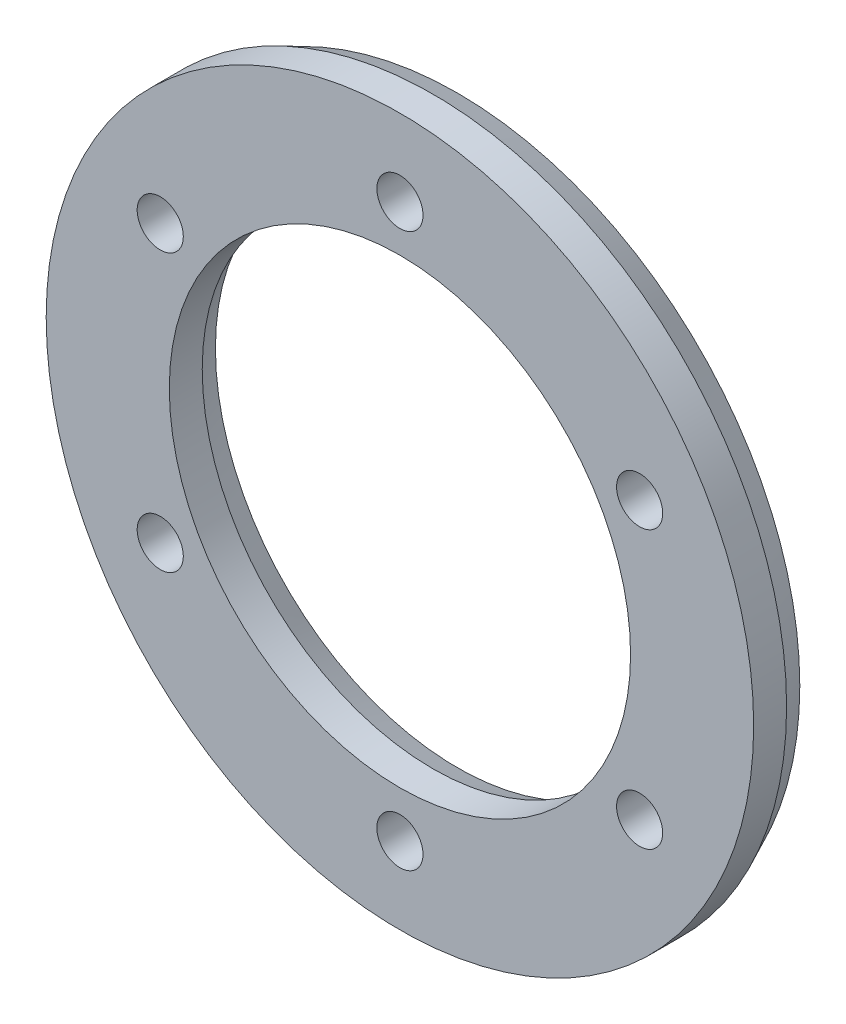
ISO-10303-21;
HEADER;
FILE_DESCRIPTION(('STEP AP214'),'2;1');
FILE_NAME('part.step','',(''),(''),'','','');
FILE_SCHEMA(('AUTOMOTIVE_DESIGN { 1 0 10303 214 1 1 1 1 }'));
ENDSEC;
DATA;
#1=APPLICATION_CONTEXT('core data for automotive mechanical design processes');
#2=APPLICATION_PROTOCOL_DEFINITION('international standard','automotive_design',2000,#1);
#3=PRODUCT_CONTEXT('',#1,'mechanical');
#4=PRODUCT('Part','Part','',(#3));
#5=PRODUCT_RELATED_PRODUCT_CATEGORY('part','',(#4));
#6=PRODUCT_DEFINITION_FORMATION('','',#4);
#7=PRODUCT_DEFINITION_CONTEXT('part definition',#1,'design');
#8=PRODUCT_DEFINITION('design','',#6,#7);
#9=PRODUCT_DEFINITION_SHAPE('','',#8);
#10=(LENGTH_UNIT() NAMED_UNIT(*) SI_UNIT(.MILLI.,.METRE.));
#11=(NAMED_UNIT(*) PLANE_ANGLE_UNIT() SI_UNIT($,.RADIAN.));
#12=(NAMED_UNIT(*) SI_UNIT($,.STERADIAN.) SOLID_ANGLE_UNIT());
#13=UNCERTAINTY_MEASURE_WITH_UNIT(LENGTH_MEASURE(1.E-05),#10,'distance_accuracy_value','');
#14=(GEOMETRIC_REPRESENTATION_CONTEXT(3) GLOBAL_UNCERTAINTY_ASSIGNED_CONTEXT((#13)) GLOBAL_UNIT_ASSIGNED_CONTEXT((#10,
#11,#12)) REPRESENTATION_CONTEXT('',''));
#15=CARTESIAN_POINT('',(0.,0.,0.));
#16=DIRECTION('',(0.,0.,1.));
#17=DIRECTION('',(1.,0.,0.));
#18=AXIS2_PLACEMENT_3D('',#15,#16,#17);
#19=CARTESIAN_POINT('',(0.,0.,5.));
#20=DIRECTION('',(0.,0.,1.));
#21=DIRECTION('',(1.,0.,0.));
#22=AXIS2_PLACEMENT_3D('',#19,#20,#21);
#23=PLANE('',#22);
#24=CARTESIAN_POINT('',(-20.7846096908266,-11.9999999999998,5.));
#25=DIRECTION('',(0.,0.,1.));
#26=DIRECTION('',(1.,0.,0.));
#27=AXIS2_PLACEMENT_3D('',#24,#25,#26);
#28=CIRCLE('',#27,2.00000000000001);
#29=CARTESIAN_POINT('',(-18.7846096908266,-11.9999999999998,5.));
#30=VERTEX_POINT('',#29);
#31=EDGE_CURVE('E107',#30,#30,#28,.T.);
#32=ORIENTED_EDGE('',*,*,#31,.F.);
#33=EDGE_LOOP('',(#32));
#34=FACE_BOUND('',#33,.T.);
#35=CARTESIAN_POINT('',(20.7846096908265,-12.0000000000001,5.));
#36=DIRECTION('',(0.,0.,1.));
#37=DIRECTION('',(1.,0.,0.));
#38=AXIS2_PLACEMENT_3D('',#35,#36,#37);
#39=CIRCLE('',#38,2.);
#40=CARTESIAN_POINT('',(22.7846096908265,-12.0000000000001,5.));
#41=VERTEX_POINT('',#40);
#42=EDGE_CURVE('E91',#41,#41,#39,.T.);
#43=ORIENTED_EDGE('',*,*,#42,.F.);
#44=EDGE_LOOP('',(#43));
#45=FACE_BOUND('',#44,.T.);
#46=CARTESIAN_POINT('',(20.7846096908266,12.,5.));
#47=DIRECTION('',(0.,0.,1.));
#48=DIRECTION('',(1.,0.,0.));
#49=AXIS2_PLACEMENT_3D('',#46,#47,#48);
#50=CIRCLE('',#49,2.00000000000001);
#51=CARTESIAN_POINT('',(22.7846096908266,12.,5.));
#52=VERTEX_POINT('',#51);
#53=EDGE_CURVE('E78',#52,#52,#50,.T.);
#54=ORIENTED_EDGE('',*,*,#53,.F.);
#55=EDGE_LOOP('',(#54));
#56=FACE_BOUND('',#55,.T.);
#57=CARTESIAN_POINT('',(0.,0.,5.));
#58=DIRECTION('',(0.,0.,1.));
#59=DIRECTION('',(1.,0.,0.));
#60=AXIS2_PLACEMENT_3D('',#57,#58,#59);
#61=CIRCLE('',#60,30.675);
#62=CARTESIAN_POINT('',(30.675,0.,5.));
#63=VERTEX_POINT('',#62);
#64=EDGE_CURVE('E70',#63,#63,#61,.T.);
#65=ORIENTED_EDGE('',*,*,#64,.T.);
#66=EDGE_LOOP('',(#65));
#67=FACE_BOUND('',#66,.T.);
#68=CARTESIAN_POINT('',(0.,0.,5.));
#69=DIRECTION('',(0.,0.,1.));
#70=DIRECTION('',(1.,0.,0.));
#71=AXIS2_PLACEMENT_3D('',#68,#69,#70);
#72=CIRCLE('',#71,20.);
#73=CARTESIAN_POINT('',(20.,0.,5.));
#74=VERTEX_POINT('',#73);
#75=EDGE_CURVE('E74',#74,#74,#72,.T.);
#76=ORIENTED_EDGE('',*,*,#75,.F.);
#77=EDGE_LOOP('',(#76));
#78=FACE_BOUND('',#77,.T.);
#79=CARTESIAN_POINT('',(0.,24.,5.));
#80=DIRECTION('',(0.,0.,1.));
#81=DIRECTION('',(1.,0.,0.));
#82=AXIS2_PLACEMENT_3D('',#79,#80,#81);
#83=CIRCLE('',#82,2.);
#84=CARTESIAN_POINT('',(2.00000000000001,24.,5.));
#85=VERTEX_POINT('',#84);
#86=EDGE_CURVE('E83',#85,#85,#83,.T.);
#87=ORIENTED_EDGE('',*,*,#86,.F.);
#88=EDGE_LOOP('',(#87));
#89=FACE_BOUND('',#88,.T.);
#90=CARTESIAN_POINT('',(-1.70530256582424E-13,-24.,5.));
#91=DIRECTION('',(0.,0.,1.));
#92=DIRECTION('',(1.,0.,0.));
#93=AXIS2_PLACEMENT_3D('',#90,#91,#92);
#94=CIRCLE('',#93,2.);
#95=CARTESIAN_POINT('',(1.99999999999983,-24.,5.));
#96=VERTEX_POINT('',#95);
#97=EDGE_CURVE('E99',#96,#96,#94,.T.);
#98=ORIENTED_EDGE('',*,*,#97,.F.);
#99=EDGE_LOOP('',(#98));
#100=FACE_BOUND('',#99,.T.);
#101=CARTESIAN_POINT('',(-20.7846096908264,12.0000000000002,5.));
#102=DIRECTION('',(0.,0.,1.));
#103=DIRECTION('',(1.,0.,0.));
#104=AXIS2_PLACEMENT_3D('',#101,#102,#103);
#105=CIRCLE('',#104,2.);
#106=CARTESIAN_POINT('',(-18.7846096908264,12.0000000000002,5.));
#107=VERTEX_POINT('',#106);
#108=EDGE_CURVE('E115',#107,#107,#105,.T.);
#109=ORIENTED_EDGE('',*,*,#108,.F.);
#110=EDGE_LOOP('',(#109));
#111=FACE_BOUND('',#110,.T.);
#112=ADVANCED_FACE('F45',(#34,#45,#56,#67,#78,#89,#100,#111),#23,.T.);
#113=CARTESIAN_POINT('',(0.,0.,0.));
#114=DIRECTION('',(0.,0.,1.));
#115=DIRECTION('',(1.,0.,0.));
#116=AXIS2_PLACEMENT_3D('',#113,#114,#115);
#117=PLANE('',#116);
#118=CARTESIAN_POINT('',(0.,0.,0.));
#119=DIRECTION('',(0.,0.,1.));
#120=DIRECTION('',(1.,0.,0.));
#121=AXIS2_PLACEMENT_3D('',#118,#119,#120);
#122=CIRCLE('',#121,29.675);
#123=CARTESIAN_POINT('',(29.675,0.,0.));
#124=VERTEX_POINT('',#123);
#125=EDGE_CURVE('E54',#124,#124,#122,.F.);
#126=ORIENTED_EDGE('',*,*,#125,.T.);
#127=EDGE_LOOP('',(#126));
#128=FACE_BOUND('',#127,.T.);
#129=CARTESIAN_POINT('',(0.,0.,0.));
#130=DIRECTION('',(0.,0.,1.));
#131=DIRECTION('',(1.,0.,0.));
#132=AXIS2_PLACEMENT_3D('',#129,#130,#131);
#133=CIRCLE('',#132,21.);
#134=CARTESIAN_POINT('',(21.,0.,0.));
#135=VERTEX_POINT('',#134);
#136=EDGE_CURVE('E59',#135,#135,#133,.T.);
#137=ORIENTED_EDGE('',*,*,#136,.T.);
#138=EDGE_LOOP('',(#137));
#139=FACE_BOUND('',#138,.T.);
#140=CARTESIAN_POINT('',(20.7846096908266,12.,0.));
#141=DIRECTION('',(0.,0.,1.));
#142=DIRECTION('',(1.,0.,0.));
#143=AXIS2_PLACEMENT_3D('',#140,#141,#142);
#144=CIRCLE('',#143,2.00000000000001);
#145=CARTESIAN_POINT('',(22.7846096908266,12.,0.));
#146=VERTEX_POINT('',#145);
#147=EDGE_CURVE('E79',#146,#146,#144,.T.);
#148=ORIENTED_EDGE('',*,*,#147,.T.);
#149=EDGE_LOOP('',(#148));
#150=FACE_BOUND('',#149,.T.);
#151=CARTESIAN_POINT('',(0.,24.,0.));
#152=DIRECTION('',(0.,0.,1.));
#153=DIRECTION('',(1.,0.,0.));
#154=AXIS2_PLACEMENT_3D('',#151,#152,#153);
#155=CIRCLE('',#154,2.);
#156=CARTESIAN_POINT('',(2.00000000000001,24.,0.));
#157=VERTEX_POINT('',#156);
#158=EDGE_CURVE('E87',#157,#157,#155,.T.);
#159=ORIENTED_EDGE('',*,*,#158,.T.);
#160=EDGE_LOOP('',(#159));
#161=FACE_BOUND('',#160,.T.);
#162=CARTESIAN_POINT('',(20.7846096908265,-12.0000000000001,0.));
#163=DIRECTION('',(0.,0.,1.));
#164=DIRECTION('',(1.,0.,0.));
#165=AXIS2_PLACEMENT_3D('',#162,#163,#164);
#166=CIRCLE('',#165,2.);
#167=CARTESIAN_POINT('',(22.7846096908265,-12.0000000000001,0.));
#168=VERTEX_POINT('',#167);
#169=EDGE_CURVE('E95',#168,#168,#166,.T.);
#170=ORIENTED_EDGE('',*,*,#169,.T.);
#171=EDGE_LOOP('',(#170));
#172=FACE_BOUND('',#171,.T.);
#173=CARTESIAN_POINT('',(-1.70530256582424E-13,-24.,0.));
#174=DIRECTION('',(0.,0.,1.));
#175=DIRECTION('',(1.,0.,0.));
#176=AXIS2_PLACEMENT_3D('',#173,#174,#175);
#177=CIRCLE('',#176,2.);
#178=CARTESIAN_POINT('',(1.99999999999983,-24.,0.));
#179=VERTEX_POINT('',#178);
#180=EDGE_CURVE('E103',#179,#179,#177,.T.);
#181=ORIENTED_EDGE('',*,*,#180,.T.);
#182=EDGE_LOOP('',(#181));
#183=FACE_BOUND('',#182,.T.);
#184=CARTESIAN_POINT('',(-20.7846096908266,-11.9999999999998,0.));
#185=DIRECTION('',(0.,0.,1.));
#186=DIRECTION('',(1.,0.,0.));
#187=AXIS2_PLACEMENT_3D('',#184,#185,#186);
#188=CIRCLE('',#187,2.00000000000001);
#189=CARTESIAN_POINT('',(-18.7846096908266,-11.9999999999998,0.));
#190=VERTEX_POINT('',#189);
#191=EDGE_CURVE('E111',#190,#190,#188,.T.);
#192=ORIENTED_EDGE('',*,*,#191,.T.);
#193=EDGE_LOOP('',(#192));
#194=FACE_BOUND('',#193,.T.);
#195=CARTESIAN_POINT('',(-20.7846096908264,12.0000000000002,0.));
#196=DIRECTION('',(0.,0.,1.));
#197=DIRECTION('',(1.,0.,0.));
#198=AXIS2_PLACEMENT_3D('',#195,#196,#197);
#199=CIRCLE('',#198,2.);
#200=CARTESIAN_POINT('',(-18.7846096908264,12.0000000000002,0.));
#201=VERTEX_POINT('',#200);
#202=EDGE_CURVE('E119',#201,#201,#199,.T.);
#203=ORIENTED_EDGE('',*,*,#202,.T.);
#204=EDGE_LOOP('',(#203));
#205=FACE_BOUND('',#204,.T.);
#206=ADVANCED_FACE('F131',(#128,#139,#150,#161,#172,#183,#194,#205),#117,.F.);
#207=CARTESIAN_POINT('',(0.,0.,5.));
#208=DIRECTION('',(0.,0.,-1.));
#209=DIRECTION('',(-1.,0.,0.));
#210=AXIS2_PLACEMENT_3D('',#207,#208,#209);
#211=CYLINDRICAL_SURFACE('',#210,30.675);
#212=CARTESIAN_POINT('',(0.,0.,2.14450692050951));
#213=DIRECTION('',(0.,0.,1.));
#214=DIRECTION('',(1.,0.,0.));
#215=AXIS2_PLACEMENT_3D('',#212,#213,#214);
#216=CIRCLE('',#215,30.675);
#217=CARTESIAN_POINT('',(30.675,0.,2.14450692050951));
#218=VERTEX_POINT('',#217);
#219=EDGE_CURVE('E64',#218,#218,#216,.T.);
#220=ORIENTED_EDGE('',*,*,#219,.T.);
#221=EDGE_LOOP('',(#220));
#222=FACE_BOUND('',#221,.T.);
#223=ORIENTED_EDGE('',*,*,#64,.F.);
#224=EDGE_LOOP('',(#223));
#225=FACE_BOUND('',#224,.T.);
#226=ADVANCED_FACE('F138',(#222,#225),#211,.T.);
#227=CARTESIAN_POINT('',(0.,0.,5.));
#228=DIRECTION('',(0.,0.,-1.));
#229=DIRECTION('',(-1.,0.,0.));
#230=AXIS2_PLACEMENT_3D('',#227,#228,#229);
#231=CYLINDRICAL_SURFACE('',#230,20.);
#232=CARTESIAN_POINT('',(0.,0.,2.14450692050961));
#233=DIRECTION('',(0.,0.,1.));
#234=DIRECTION('',(1.,0.,0.));
#235=AXIS2_PLACEMENT_3D('',#232,#233,#234);
#236=CIRCLE('',#235,20.);
#237=CARTESIAN_POINT('',(20.,0.,2.14450692050961));
#238=VERTEX_POINT('',#237);
#239=EDGE_CURVE('E10',#238,#238,#236,.F.);
#240=ORIENTED_EDGE('',*,*,#239,.T.);
#241=EDGE_LOOP('',(#240));
#242=FACE_BOUND('',#241,.T.);
#243=ORIENTED_EDGE('',*,*,#75,.T.);
#244=EDGE_LOOP('',(#243));
#245=FACE_BOUND('',#244,.T.);
#246=ADVANCED_FACE('F143',(#242,#245),#231,.F.);
#247=CARTESIAN_POINT('',(20.7846096908266,12.,5.));
#248=DIRECTION('',(0.,0.,-1.));
#249=DIRECTION('',(-1.,0.,0.));
#250=AXIS2_PLACEMENT_3D('',#247,#248,#249);
#251=CYLINDRICAL_SURFACE('',#250,2.00000000000001);
#252=ORIENTED_EDGE('',*,*,#53,.T.);
#253=EDGE_LOOP('',(#252));
#254=FACE_BOUND('',#253,.T.);
#255=ORIENTED_EDGE('',*,*,#147,.F.);
#256=EDGE_LOOP('',(#255));
#257=FACE_BOUND('',#256,.T.);
#258=ADVANCED_FACE('F197',(#254,#257),#251,.F.);
#259=CARTESIAN_POINT('',(0.,24.,5.));
#260=DIRECTION('',(0.,0.,-1.));
#261=DIRECTION('',(-1.,0.,0.));
#262=AXIS2_PLACEMENT_3D('',#259,#260,#261);
#263=CYLINDRICAL_SURFACE('',#262,2.);
#264=ORIENTED_EDGE('',*,*,#86,.T.);
#265=EDGE_LOOP('',(#264));
#266=FACE_BOUND('',#265,.T.);
#267=ORIENTED_EDGE('',*,*,#158,.F.);
#268=EDGE_LOOP('',(#267));
#269=FACE_BOUND('',#268,.T.);
#270=ADVANCED_FACE('F194',(#266,#269),#263,.F.);
#271=CARTESIAN_POINT('',(20.7846096908265,-12.0000000000001,5.));
#272=DIRECTION('',(0.,0.,-1.));
#273=DIRECTION('',(-1.,0.,0.));
#274=AXIS2_PLACEMENT_3D('',#271,#272,#273);
#275=CYLINDRICAL_SURFACE('',#274,2.);
#276=ORIENTED_EDGE('',*,*,#42,.T.);
#277=EDGE_LOOP('',(#276));
#278=FACE_BOUND('',#277,.T.);
#279=ORIENTED_EDGE('',*,*,#169,.F.);
#280=EDGE_LOOP('',(#279));
#281=FACE_BOUND('',#280,.T.);
#282=ADVANCED_FACE('F177',(#278,#281),#275,.F.);
#283=CARTESIAN_POINT('',(-1.70530256582424E-13,-24.,5.));
#284=DIRECTION('',(0.,0.,-1.));
#285=DIRECTION('',(-1.,0.,0.));
#286=AXIS2_PLACEMENT_3D('',#283,#284,#285);
#287=CYLINDRICAL_SURFACE('',#286,2.);
#288=ORIENTED_EDGE('',*,*,#97,.T.);
#289=EDGE_LOOP('',(#288));
#290=FACE_BOUND('',#289,.T.);
#291=ORIENTED_EDGE('',*,*,#180,.F.);
#292=EDGE_LOOP('',(#291));
#293=FACE_BOUND('',#292,.T.);
#294=ADVANCED_FACE('F174',(#290,#293),#287,.F.);
#295=CARTESIAN_POINT('',(-20.7846096908266,-11.9999999999998,5.));
#296=DIRECTION('',(0.,0.,-1.));
#297=DIRECTION('',(-1.,0.,0.));
#298=AXIS2_PLACEMENT_3D('',#295,#296,#297);
#299=CYLINDRICAL_SURFACE('',#298,2.00000000000001);
#300=ORIENTED_EDGE('',*,*,#31,.T.);
#301=EDGE_LOOP('',(#300));
#302=FACE_BOUND('',#301,.T.);
#303=ORIENTED_EDGE('',*,*,#191,.F.);
#304=EDGE_LOOP('',(#303));
#305=FACE_BOUND('',#304,.T.);
#306=ADVANCED_FACE('F160',(#302,#305),#299,.F.);
#307=CARTESIAN_POINT('',(-20.7846096908264,12.0000000000002,5.));
#308=DIRECTION('',(0.,0.,-1.));
#309=DIRECTION('',(-1.,0.,0.));
#310=AXIS2_PLACEMENT_3D('',#307,#308,#309);
#311=CYLINDRICAL_SURFACE('',#310,2.);
#312=ORIENTED_EDGE('',*,*,#108,.T.);
#313=EDGE_LOOP('',(#312));
#314=FACE_BOUND('',#313,.T.);
#315=ORIENTED_EDGE('',*,*,#202,.F.);
#316=EDGE_LOOP('',(#315));
#317=FACE_BOUND('',#316,.T.);
#318=ADVANCED_FACE('F127',(#314,#317),#311,.F.);
#319=CARTESIAN_POINT('',(0.,0.,2.14450692050951));
#320=DIRECTION('',(0.,0.,1.));
#321=DIRECTION('',(1.,0.,0.));
#322=AXIS2_PLACEMENT_3D('',#319,#320,#321);
#323=CONICAL_SURFACE('',#322,30.675,0.436332312998584);
#324=ORIENTED_EDGE('',*,*,#125,.F.);
#325=EDGE_LOOP('',(#324));
#326=FACE_BOUND('',#325,.T.);
#327=ORIENTED_EDGE('',*,*,#219,.F.);
#328=EDGE_LOOP('',(#327));
#329=FACE_BOUND('',#328,.T.);
#330=ADVANCED_FACE('F149',(#326,#329),#323,.T.);
#331=CARTESIAN_POINT('',(0.,0.,0.));
#332=DIRECTION('',(0.,0.,-1.));
#333=DIRECTION('',(-1.,0.,0.));
#334=AXIS2_PLACEMENT_3D('',#331,#332,#333);
#335=CONICAL_SURFACE('',#334,21.,0.436332312998579);
#336=ORIENTED_EDGE('',*,*,#239,.F.);
#337=EDGE_LOOP('',(#336));
#338=FACE_BOUND('',#337,.T.);
#339=ORIENTED_EDGE('',*,*,#136,.F.);
#340=EDGE_LOOP('',(#339));
#341=FACE_BOUND('',#340,.T.);
#342=ADVANCED_FACE('F48',(#338,#341),#335,.F.);
#343=CLOSED_SHELL('',(#112,#206,#226,#246,#258,#270,#282,#294,#306,#318,#330,#342));
#344=MANIFOLD_SOLID_BREP('B2',#343);
#345=ADVANCED_BREP_SHAPE_REPRESENTATION('',(#18,#344),#14);
#346=SHAPE_DEFINITION_REPRESENTATION(#9,#345);
ENDSEC;
END-ISO-10303-21;
